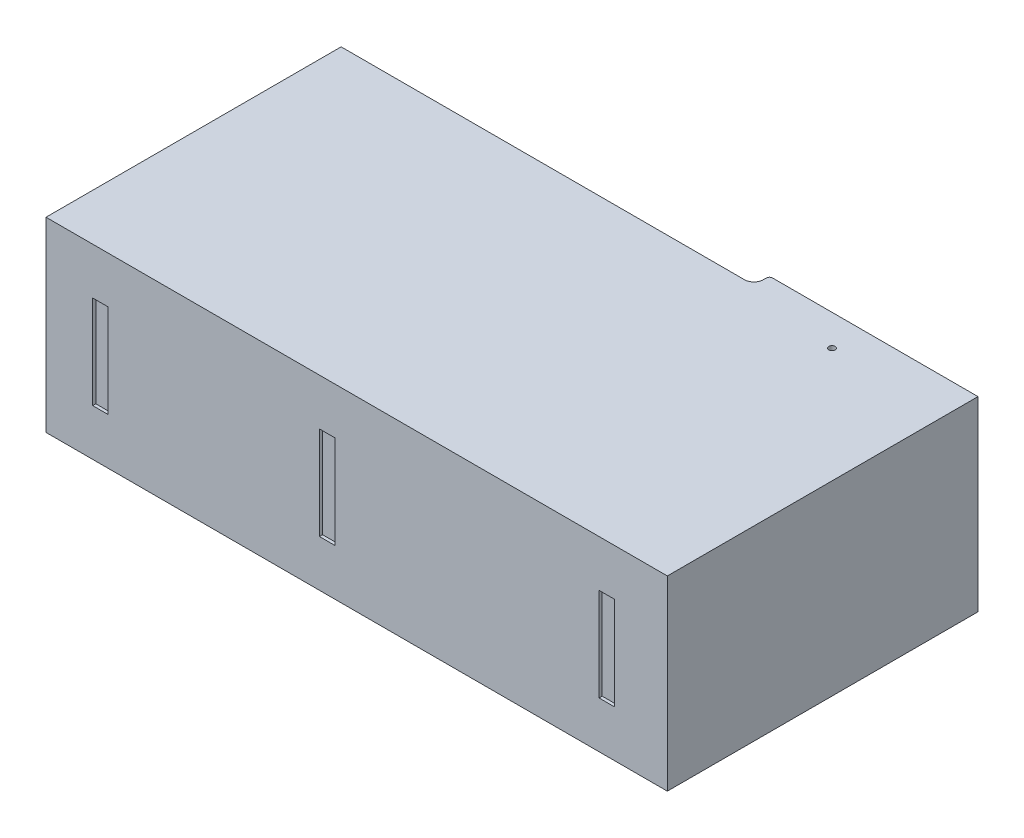
ISO-10303-21;
HEADER;
FILE_DESCRIPTION(('STEP AP214'),'2;1');
FILE_NAME('part.step','',(''),(''),'','','');
FILE_SCHEMA(('AUTOMOTIVE_DESIGN { 1 0 10303 214 1 1 1 1 }'));
ENDSEC;
DATA;
#1=APPLICATION_CONTEXT('core data for automotive mechanical design processes');
#2=APPLICATION_PROTOCOL_DEFINITION('international standard','automotive_design',2000,#1);
#3=PRODUCT_CONTEXT('',#1,'mechanical');
#4=PRODUCT('Part','Part','',(#3));
#5=PRODUCT_RELATED_PRODUCT_CATEGORY('part','',(#4));
#6=PRODUCT_DEFINITION_FORMATION('','',#4);
#7=PRODUCT_DEFINITION_CONTEXT('part definition',#1,'design');
#8=PRODUCT_DEFINITION('design','',#6,#7);
#9=PRODUCT_DEFINITION_SHAPE('','',#8);
#10=(LENGTH_UNIT() NAMED_UNIT(*) SI_UNIT(.MILLI.,.METRE.));
#11=(NAMED_UNIT(*) PLANE_ANGLE_UNIT() SI_UNIT($,.RADIAN.));
#12=(NAMED_UNIT(*) SI_UNIT($,.STERADIAN.) SOLID_ANGLE_UNIT());
#13=UNCERTAINTY_MEASURE_WITH_UNIT(LENGTH_MEASURE(1.E-05),#10,'distance_accuracy_value','');
#14=(GEOMETRIC_REPRESENTATION_CONTEXT(3) GLOBAL_UNCERTAINTY_ASSIGNED_CONTEXT((#13)) GLOBAL_UNIT_ASSIGNED_CONTEXT((#10,
#11,#12)) REPRESENTATION_CONTEXT('',''));
#15=CARTESIAN_POINT('',(0.,0.,0.));
#16=DIRECTION('',(0.,0.,1.));
#17=DIRECTION('',(1.,0.,0.));
#18=AXIS2_PLACEMENT_3D('',#15,#16,#17);
#19=CARTESIAN_POINT('',(3.28673392675044,6.,0.));
#20=DIRECTION('',(-1.,0.,0.));
#21=DIRECTION('',(0.,0.,1.));
#22=AXIS2_PLACEMENT_3D('',#19,#20,#21);
#23=PLANE('',#22);
#24=DIRECTION('',(0.,0.,-1.));
#25=VECTOR('',#24,1.);
#26=CARTESIAN_POINT('',(3.28673392675044,6.,0.));
#27=LINE('',#26,#25);
#28=CARTESIAN_POINT('',(3.28673392675044,6.,-4.8));
#29=VERTEX_POINT('',#28);
#30=CARTESIAN_POINT('',(3.28673392675044,6.,-4.9));
#31=VERTEX_POINT('',#30);
#32=EDGE_CURVE('E336',#29,#31,#27,.T.);
#33=ORIENTED_EDGE('',*,*,#32,.T.);
#34=DIRECTION('',(0.,-1.,0.));
#35=VECTOR('',#34,1.);
#36=CARTESIAN_POINT('',(3.28673392675044,0.,-4.9));
#37=LINE('',#36,#35);
#38=CARTESIAN_POINT('',(3.28673392675044,0.,-4.9));
#39=VERTEX_POINT('',#38);
#40=EDGE_CURVE('E387',#31,#39,#37,.T.);
#41=ORIENTED_EDGE('',*,*,#40,.T.);
#42=DIRECTION('',(0.,0.,-1.));
#43=VECTOR('',#42,1.);
#44=CARTESIAN_POINT('',(3.28673392675044,0.,0.));
#45=LINE('',#44,#43);
#46=CARTESIAN_POINT('',(3.28673392675044,0.,-4.8));
#47=VERTEX_POINT('',#46);
#48=EDGE_CURVE('E329',#47,#39,#45,.T.);
#49=ORIENTED_EDGE('',*,*,#48,.F.);
#50=DIRECTION('',(0.,-1.,0.));
#51=VECTOR('',#50,1.);
#52=CARTESIAN_POINT('',(3.28673392675044,6.,-4.8));
#53=LINE('',#52,#51);
#54=EDGE_CURVE('E385',#29,#47,#53,.T.);
#55=ORIENTED_EDGE('',*,*,#54,.F.);
#56=EDGE_LOOP('',(#33,#41,#49,#55));
#57=FACE_BOUND('',#56,.T.);
#58=ADVANCED_FACE('F37',(#57),#23,.T.);
#59=CARTESIAN_POINT('',(2.98673392675044,6.,-4.8));
#60=DIRECTION('',(0.,-1.,0.));
#61=DIRECTION('',(0.,0.,-1.));
#62=AXIS2_PLACEMENT_3D('',#59,#60,#61);
#63=CYLINDRICAL_SURFACE('',#62,0.3);
#64=CARTESIAN_POINT('',(2.98673392675044,0.,-4.8));
#65=DIRECTION('',(0.,1.,0.));
#66=DIRECTION('',(0.,0.,1.));
#67=AXIS2_PLACEMENT_3D('',#64,#65,#66);
#68=CIRCLE('',#67,0.3);
#69=CARTESIAN_POINT('',(2.98673392675043,0.,-4.5));
#70=VERTEX_POINT('',#69);
#71=EDGE_CURVE('E359',#47,#70,#68,.F.);
#72=ORIENTED_EDGE('',*,*,#71,.T.);
#73=DIRECTION('',(0.,-1.,0.));
#74=VECTOR('',#73,1.);
#75=CARTESIAN_POINT('',(2.98673392675043,6.,-4.5));
#76=LINE('',#75,#74);
#77=CARTESIAN_POINT('',(2.98673392675043,6.,-4.5));
#78=VERTEX_POINT('',#77);
#79=EDGE_CURVE('E383',#78,#70,#76,.T.);
#80=ORIENTED_EDGE('',*,*,#79,.F.);
#81=CARTESIAN_POINT('',(2.98673392675044,6.,-4.8));
#82=DIRECTION('',(0.,1.,0.));
#83=DIRECTION('',(0.,0.,1.));
#84=AXIS2_PLACEMENT_3D('',#81,#82,#83);
#85=CIRCLE('',#84,0.3);
#86=EDGE_CURVE('E339',#29,#78,#85,.F.);
#87=ORIENTED_EDGE('',*,*,#86,.F.);
#88=ORIENTED_EDGE('',*,*,#54,.T.);
#89=EDGE_LOOP('',(#72,#80,#87,#88));
#90=FACE_BOUND('',#89,.T.);
#91=ADVANCED_FACE('F413',(#90),#63,.F.);
#92=CARTESIAN_POINT('',(0.,6.,-4.5));
#93=DIRECTION('',(0.,0.,-1.));
#94=DIRECTION('',(-1.,0.,0.));
#95=AXIS2_PLACEMENT_3D('',#92,#93,#94);
#96=PLANE('',#95);
#97=DIRECTION('',(0.,-1.,0.));
#98=VECTOR('',#97,1.);
#99=CARTESIAN_POINT('',(1.38673392675044,1.35,-4.5));
#100=LINE('',#99,#98);
#101=CARTESIAN_POINT('',(1.38673392675044,4.65,-4.5));
#102=VERTEX_POINT('',#101);
#103=CARTESIAN_POINT('',(1.38673392675044,1.35,-4.5));
#104=VERTEX_POINT('',#103);
#105=EDGE_CURVE('E303',#102,#104,#100,.T.);
#106=ORIENTED_EDGE('',*,*,#105,.F.);
#107=DIRECTION('',(1.,0.,0.));
#108=VECTOR('',#107,1.);
#109=CARTESIAN_POINT('',(-0.613266073249563,4.65,-4.5));
#110=LINE('',#109,#108);
#111=CARTESIAN_POINT('',(-0.613266073249563,4.65,-4.5));
#112=VERTEX_POINT('',#111);
#113=EDGE_CURVE('E308',#112,#102,#110,.T.);
#114=ORIENTED_EDGE('',*,*,#113,.F.);
#115=DIRECTION('',(0.,1.,0.));
#116=VECTOR('',#115,1.);
#117=CARTESIAN_POINT('',(-0.613266073249563,1.35,-4.5));
#118=LINE('',#117,#116);
#119=CARTESIAN_POINT('',(-0.613266073249563,1.35,-4.5));
#120=VERTEX_POINT('',#119);
#121=EDGE_CURVE('E322',#120,#112,#118,.T.);
#122=ORIENTED_EDGE('',*,*,#121,.F.);
#123=DIRECTION('',(-1.,0.,0.));
#124=VECTOR('',#123,1.);
#125=CARTESIAN_POINT('',(-0.613266073249563,1.35,-4.5));
#126=LINE('',#125,#124);
#127=EDGE_CURVE('E319',#104,#120,#126,.T.);
#128=ORIENTED_EDGE('',*,*,#127,.F.);
#129=EDGE_LOOP('',(#106,#114,#122,#128));
#130=FACE_BOUND('',#129,.T.);
#131=DIRECTION('',(1.,0.,0.));
#132=VECTOR('',#131,1.);
#133=CARTESIAN_POINT('',(0.,0.,-4.5));
#134=LINE('',#133,#132);
#135=CARTESIAN_POINT('',(-10.,0.,-4.5));
#136=VERTEX_POINT('',#135);
#137=EDGE_CURVE('E362',#136,#70,#134,.T.);
#138=ORIENTED_EDGE('',*,*,#137,.F.);
#139=DIRECTION('',(0.,-1.,0.));
#140=VECTOR('',#139,1.);
#141=CARTESIAN_POINT('',(-10.,6.,-4.5));
#142=LINE('',#141,#140);
#143=CARTESIAN_POINT('',(-10.,6.,-4.5));
#144=VERTEX_POINT('',#143);
#145=EDGE_CURVE('E381',#144,#136,#142,.T.);
#146=ORIENTED_EDGE('',*,*,#145,.F.);
#147=DIRECTION('',(1.,0.,0.));
#148=VECTOR('',#147,1.);
#149=CARTESIAN_POINT('',(0.,6.,-4.5));
#150=LINE('',#149,#148);
#151=EDGE_CURVE('E342',#144,#78,#150,.T.);
#152=ORIENTED_EDGE('',*,*,#151,.T.);
#153=ORIENTED_EDGE('',*,*,#79,.T.);
#154=EDGE_LOOP('',(#138,#146,#152,#153));
#155=FACE_BOUND('',#154,.T.);
#156=ADVANCED_FACE('F440',(#130,#155),#96,.T.);
#157=CARTESIAN_POINT('',(-10.,6.,0.));
#158=DIRECTION('',(-1.,0.,0.));
#159=DIRECTION('',(0.,0.,1.));
#160=AXIS2_PLACEMENT_3D('',#157,#158,#159);
#161=PLANE('',#160);
#162=DIRECTION('',(0.,0.,-1.));
#163=VECTOR('',#162,1.);
#164=CARTESIAN_POINT('',(-10.,0.,0.));
#165=LINE('',#164,#163);
#166=CARTESIAN_POINT('',(-10.,0.,5.));
#167=VERTEX_POINT('',#166);
#168=EDGE_CURVE('E365',#167,#136,#165,.T.);
#169=ORIENTED_EDGE('',*,*,#168,.F.);
#170=DIRECTION('',(0.,-1.,0.));
#171=VECTOR('',#170,1.);
#172=CARTESIAN_POINT('',(-10.,6.,5.));
#173=LINE('',#172,#171);
#174=CARTESIAN_POINT('',(-10.,6.,5.));
#175=VERTEX_POINT('',#174);
#176=EDGE_CURVE('E379',#175,#167,#173,.T.);
#177=ORIENTED_EDGE('',*,*,#176,.F.);
#178=DIRECTION('',(0.,0.,-1.));
#179=VECTOR('',#178,1.);
#180=CARTESIAN_POINT('',(-10.,6.,0.));
#181=LINE('',#180,#179);
#182=EDGE_CURVE('E345',#175,#144,#181,.T.);
#183=ORIENTED_EDGE('',*,*,#182,.T.);
#184=ORIENTED_EDGE('',*,*,#145,.T.);
#185=EDGE_LOOP('',(#169,#177,#183,#184));
#186=FACE_BOUND('',#185,.T.);
#187=ADVANCED_FACE('F420',(#186),#161,.T.);
#188=CARTESIAN_POINT('',(0.,6.,5.));
#189=DIRECTION('',(0.,0.,1.));
#190=DIRECTION('',(1.,0.,0.));
#191=AXIS2_PLACEMENT_3D('',#188,#189,#190);
#192=PLANE('',#191);
#193=DIRECTION('',(0.,-1.,0.));
#194=VECTOR('',#193,1.);
#195=CARTESIAN_POINT('',(-8.49720041105568,1.5,5.));
#196=LINE('',#195,#194);
#197=CARTESIAN_POINT('',(-8.49720041105568,4.5,5.));
#198=VERTEX_POINT('',#197);
#199=CARTESIAN_POINT('',(-8.49720041105568,1.5,5.));
#200=VERTEX_POINT('',#199);
#201=EDGE_CURVE('E52',#198,#200,#196,.T.);
#202=ORIENTED_EDGE('',*,*,#201,.F.);
#203=DIRECTION('',(-1.,0.,0.));
#204=VECTOR('',#203,1.);
#205=CARTESIAN_POINT('',(-7.99720041105568,4.5,5.));
#206=LINE('',#205,#204);
#207=CARTESIAN_POINT('',(-7.99720041105568,4.5,5.));
#208=VERTEX_POINT('',#207);
#209=EDGE_CURVE('E217',#208,#198,#206,.T.);
#210=ORIENTED_EDGE('',*,*,#209,.F.);
#211=DIRECTION('',(0.,1.,0.));
#212=VECTOR('',#211,1.);
#213=CARTESIAN_POINT('',(-7.99720041105568,1.5,5.));
#214=LINE('',#213,#212);
#215=CARTESIAN_POINT('',(-7.99720041105568,1.5,5.));
#216=VERTEX_POINT('',#215);
#217=EDGE_CURVE('E220',#216,#208,#214,.T.);
#218=ORIENTED_EDGE('',*,*,#217,.F.);
#219=DIRECTION('',(1.,0.,0.));
#220=VECTOR('',#219,1.);
#221=CARTESIAN_POINT('',(-7.99720041105568,1.5,5.));
#222=LINE('',#221,#220);
#223=EDGE_CURVE('E226',#200,#216,#222,.T.);
#224=ORIENTED_EDGE('',*,*,#223,.F.);
#225=EDGE_LOOP('',(#202,#210,#218,#224));
#226=FACE_BOUND('',#225,.T.);
#227=DIRECTION('',(0.,-1.,0.));
#228=VECTOR('',#227,1.);
#229=CARTESIAN_POINT('',(-1.19720041105568,1.5,5.));
#230=LINE('',#229,#228);
#231=CARTESIAN_POINT('',(-1.19720041105568,4.5,5.));
#232=VERTEX_POINT('',#231);
#233=CARTESIAN_POINT('',(-1.19720041105568,1.5,5.));
#234=VERTEX_POINT('',#233);
#235=EDGE_CURVE('E60',#232,#234,#230,.T.);
#236=ORIENTED_EDGE('',*,*,#235,.F.);
#237=DIRECTION('',(-1.,0.,0.));
#238=VECTOR('',#237,1.);
#239=CARTESIAN_POINT('',(-0.69720041105568,4.5,5.));
#240=LINE('',#239,#238);
#241=CARTESIAN_POINT('',(-0.69720041105568,4.5,5.));
#242=VERTEX_POINT('',#241);
#243=EDGE_CURVE('E241',#242,#232,#240,.T.);
#244=ORIENTED_EDGE('',*,*,#243,.F.);
#245=DIRECTION('',(0.,1.,0.));
#246=VECTOR('',#245,1.);
#247=CARTESIAN_POINT('',(-0.69720041105568,1.5,5.));
#248=LINE('',#247,#246);
#249=CARTESIAN_POINT('',(-0.69720041105568,1.5,5.));
#250=VERTEX_POINT('',#249);
#251=EDGE_CURVE('E256',#250,#242,#248,.T.);
#252=ORIENTED_EDGE('',*,*,#251,.F.);
#253=DIRECTION('',(1.,0.,0.));
#254=VECTOR('',#253,1.);
#255=CARTESIAN_POINT('',(-0.69720041105568,1.5,5.));
#256=LINE('',#255,#254);
#257=EDGE_CURVE('E252',#234,#250,#256,.T.);
#258=ORIENTED_EDGE('',*,*,#257,.F.);
#259=EDGE_LOOP('',(#236,#244,#252,#258));
#260=FACE_BOUND('',#259,.T.);
#261=DIRECTION('',(0.,-1.,0.));
#262=VECTOR('',#261,1.);
#263=CARTESIAN_POINT('',(7.80279958894432,1.5,5.));
#264=LINE('',#263,#262);
#265=CARTESIAN_POINT('',(7.80279958894432,4.5,5.));
#266=VERTEX_POINT('',#265);
#267=CARTESIAN_POINT('',(7.80279958894432,1.5,5.));
#268=VERTEX_POINT('',#267);
#269=EDGE_CURVE('E281',#266,#268,#264,.T.);
#270=ORIENTED_EDGE('',*,*,#269,.F.);
#271=DIRECTION('',(-1.,0.,0.));
#272=VECTOR('',#271,1.);
#273=CARTESIAN_POINT('',(8.30279958894432,4.5,5.));
#274=LINE('',#273,#272);
#275=CARTESIAN_POINT('',(8.30279958894432,4.5,5.));
#276=VERTEX_POINT('',#275);
#277=EDGE_CURVE('E271',#276,#266,#274,.T.);
#278=ORIENTED_EDGE('',*,*,#277,.F.);
#279=DIRECTION('',(0.,1.,0.));
#280=VECTOR('',#279,1.);
#281=CARTESIAN_POINT('',(8.30279958894432,1.5,5.));
#282=LINE('',#281,#280);
#283=CARTESIAN_POINT('',(8.30279958894432,1.5,5.));
#284=VERTEX_POINT('',#283);
#285=EDGE_CURVE('E286',#284,#276,#282,.T.);
#286=ORIENTED_EDGE('',*,*,#285,.F.);
#287=DIRECTION('',(1.,0.,0.));
#288=VECTOR('',#287,1.);
#289=CARTESIAN_POINT('',(8.30279958894432,1.5,5.));
#290=LINE('',#289,#288);
#291=EDGE_CURVE('E283',#268,#284,#290,.T.);
#292=ORIENTED_EDGE('',*,*,#291,.F.);
#293=EDGE_LOOP('',(#270,#278,#286,#292));
#294=FACE_BOUND('',#293,.T.);
#295=DIRECTION('',(-1.,0.,0.));
#296=VECTOR('',#295,1.);
#297=CARTESIAN_POINT('',(0.,0.,5.));
#298=LINE('',#297,#296);
#299=CARTESIAN_POINT('',(10.,0.,5.));
#300=VERTEX_POINT('',#299);
#301=EDGE_CURVE('E368',#300,#167,#298,.T.);
#302=ORIENTED_EDGE('',*,*,#301,.F.);
#303=DIRECTION('',(0.,-1.,0.));
#304=VECTOR('',#303,1.);
#305=CARTESIAN_POINT('',(10.,6.,5.));
#306=LINE('',#305,#304);
#307=CARTESIAN_POINT('',(10.,6.,5.));
#308=VERTEX_POINT('',#307);
#309=EDGE_CURVE('E377',#308,#300,#306,.T.);
#310=ORIENTED_EDGE('',*,*,#309,.F.);
#311=DIRECTION('',(-1.,0.,0.));
#312=VECTOR('',#311,1.);
#313=CARTESIAN_POINT('',(0.,6.,5.));
#314=LINE('',#313,#312);
#315=EDGE_CURVE('E348',#308,#175,#314,.T.);
#316=ORIENTED_EDGE('',*,*,#315,.T.);
#317=ORIENTED_EDGE('',*,*,#176,.T.);
#318=EDGE_LOOP('',(#302,#310,#316,#317));
#319=FACE_BOUND('',#318,.T.);
#320=ADVANCED_FACE('F423',(#226,#260,#294,#319),#192,.T.);
#321=CARTESIAN_POINT('',(10.,6.,0.));
#322=DIRECTION('',(-1.,0.,0.));
#323=DIRECTION('',(0.,0.,1.));
#324=AXIS2_PLACEMENT_3D('',#321,#322,#323);
#325=PLANE('',#324);
#326=DIRECTION('',(0.,0.,-1.));
#327=VECTOR('',#326,1.);
#328=CARTESIAN_POINT('',(10.,0.,0.));
#329=LINE('',#328,#327);
#330=CARTESIAN_POINT('',(10.,0.,-5.));
#331=VERTEX_POINT('',#330);
#332=EDGE_CURVE('E371',#300,#331,#329,.T.);
#333=ORIENTED_EDGE('',*,*,#332,.T.);
#334=DIRECTION('',(0.,-1.,0.));
#335=VECTOR('',#334,1.);
#336=CARTESIAN_POINT('',(10.,6.,-5.));
#337=LINE('',#336,#335);
#338=CARTESIAN_POINT('',(10.,6.,-5.));
#339=VERTEX_POINT('',#338);
#340=EDGE_CURVE('E356',#339,#331,#337,.T.);
#341=ORIENTED_EDGE('',*,*,#340,.F.);
#342=DIRECTION('',(0.,0.,-1.));
#343=VECTOR('',#342,1.);
#344=CARTESIAN_POINT('',(10.,6.,0.));
#345=LINE('',#344,#343);
#346=EDGE_CURVE('E351',#308,#339,#345,.T.);
#347=ORIENTED_EDGE('',*,*,#346,.F.);
#348=ORIENTED_EDGE('',*,*,#309,.T.);
#349=EDGE_LOOP('',(#333,#341,#347,#348));
#350=FACE_BOUND('',#349,.T.);
#351=ADVANCED_FACE('F426',(#350),#325,.F.);
#352=CARTESIAN_POINT('',(0.,6.,-5.));
#353=DIRECTION('',(0.,0.,1.));
#354=DIRECTION('',(1.,0.,0.));
#355=AXIS2_PLACEMENT_3D('',#352,#353,#354);
#356=PLANE('',#355);
#357=DIRECTION('',(-1.,0.,0.));
#358=VECTOR('',#357,1.);
#359=CARTESIAN_POINT('',(0.,0.,-5.));
#360=LINE('',#359,#358);
#361=CARTESIAN_POINT('',(3.38673392675044,0.,-5.));
#362=VERTEX_POINT('',#361);
#363=EDGE_CURVE('E340',#331,#362,#360,.T.);
#364=ORIENTED_EDGE('',*,*,#363,.T.);
#365=DIRECTION('',(0.,-1.,0.));
#366=VECTOR('',#365,1.);
#367=CARTESIAN_POINT('',(3.38673392675044,6.,-5.));
#368=LINE('',#367,#366);
#369=CARTESIAN_POINT('',(3.38673392675044,6.,-5.));
#370=VERTEX_POINT('',#369);
#371=EDGE_CURVE('E45',#362,#370,#368,.F.);
#372=ORIENTED_EDGE('',*,*,#371,.T.);
#373=DIRECTION('',(-1.,0.,0.));
#374=VECTOR('',#373,1.);
#375=CARTESIAN_POINT('',(0.,6.,-5.));
#376=LINE('',#375,#374);
#377=EDGE_CURVE('E353',#339,#370,#376,.T.);
#378=ORIENTED_EDGE('',*,*,#377,.F.);
#379=ORIENTED_EDGE('',*,*,#340,.T.);
#380=EDGE_LOOP('',(#364,#372,#378,#379));
#381=FACE_BOUND('',#380,.T.);
#382=ADVANCED_FACE('F394',(#381),#356,.F.);
#383=CARTESIAN_POINT('',(0.,6.,0.));
#384=DIRECTION('',(0.,1.,0.));
#385=DIRECTION('',(0.,0.,1.));
#386=AXIS2_PLACEMENT_3D('',#383,#384,#385);
#387=PLANE('',#386);
#388=CARTESIAN_POINT('',(6.3,6.,-4.));
#389=DIRECTION('',(0.,1.,0.));
#390=DIRECTION('',(0.,0.,1.));
#391=AXIS2_PLACEMENT_3D('',#388,#389,#390);
#392=CIRCLE('',#391,0.1);
#393=CARTESIAN_POINT('',(6.3,6.,-3.9));
#394=VERTEX_POINT('',#393);
#395=EDGE_CURVE('E233',#394,#394,#392,.T.);
#396=ORIENTED_EDGE('',*,*,#395,.F.);
#397=EDGE_LOOP('',(#396));
#398=FACE_BOUND('',#397,.T.);
#399=ORIENTED_EDGE('',*,*,#377,.T.);
#400=CARTESIAN_POINT('',(3.38673392675044,6.,-4.9));
#401=DIRECTION('',(0.,1.,0.));
#402=DIRECTION('',(0.,0.,1.));
#403=AXIS2_PLACEMENT_3D('',#400,#401,#402);
#404=CIRCLE('',#403,0.1);
#405=EDGE_CURVE('E11',#370,#31,#404,.T.);
#406=ORIENTED_EDGE('',*,*,#405,.T.);
#407=ORIENTED_EDGE('',*,*,#32,.F.);
#408=ORIENTED_EDGE('',*,*,#86,.T.);
#409=ORIENTED_EDGE('',*,*,#151,.F.);
#410=ORIENTED_EDGE('',*,*,#182,.F.);
#411=ORIENTED_EDGE('',*,*,#315,.F.);
#412=ORIENTED_EDGE('',*,*,#346,.T.);
#413=EDGE_LOOP('',(#399,#406,#407,#408,#409,#410,#411,#412));
#414=FACE_BOUND('',#413,.T.);
#415=ADVANCED_FACE('F399',(#398,#414),#387,.T.);
#416=CARTESIAN_POINT('',(0.,0.,0.));
#417=DIRECTION('',(0.,1.,0.));
#418=DIRECTION('',(0.,0.,1.));
#419=AXIS2_PLACEMENT_3D('',#416,#417,#418);
#420=PLANE('',#419);
#421=CARTESIAN_POINT('',(6.3,0.,-4.));
#422=DIRECTION('',(0.,1.,0.));
#423=DIRECTION('',(0.,0.,1.));
#424=AXIS2_PLACEMENT_3D('',#421,#422,#423);
#425=CIRCLE('',#424,0.1);
#426=CARTESIAN_POINT('',(6.3,0.,-3.9));
#427=VERTEX_POINT('',#426);
#428=EDGE_CURVE('E300',#427,#427,#425,.F.);
#429=ORIENTED_EDGE('',*,*,#428,.F.);
#430=EDGE_LOOP('',(#429));
#431=FACE_BOUND('',#430,.T.);
#432=ORIENTED_EDGE('',*,*,#48,.T.);
#433=CARTESIAN_POINT('',(3.38673392675044,0.,-4.9));
#434=DIRECTION('',(0.,1.,0.));
#435=DIRECTION('',(0.,0.,1.));
#436=AXIS2_PLACEMENT_3D('',#433,#434,#435);
#437=CIRCLE('',#436,0.1);
#438=EDGE_CURVE('E390',#39,#362,#437,.F.);
#439=ORIENTED_EDGE('',*,*,#438,.T.);
#440=ORIENTED_EDGE('',*,*,#363,.F.);
#441=ORIENTED_EDGE('',*,*,#332,.F.);
#442=ORIENTED_EDGE('',*,*,#301,.T.);
#443=ORIENTED_EDGE('',*,*,#168,.T.);
#444=ORIENTED_EDGE('',*,*,#137,.T.);
#445=ORIENTED_EDGE('',*,*,#71,.F.);
#446=EDGE_LOOP('',(#432,#439,#440,#441,#442,#443,#444,#445));
#447=FACE_BOUND('',#446,.T.);
#448=ADVANCED_FACE('F409',(#431,#447),#420,.F.);
#449=CARTESIAN_POINT('',(3.38673392675044,6.,-4.9));
#450=DIRECTION('',(0.,1.,0.));
#451=DIRECTION('',(0.,0.,1.));
#452=AXIS2_PLACEMENT_3D('',#449,#450,#451);
#453=CYLINDRICAL_SURFACE('',#452,0.1);
#454=ORIENTED_EDGE('',*,*,#405,.F.);
#455=ORIENTED_EDGE('',*,*,#371,.F.);
#456=ORIENTED_EDGE('',*,*,#438,.F.);
#457=ORIENTED_EDGE('',*,*,#40,.F.);
#458=EDGE_LOOP('',(#454,#455,#456,#457));
#459=FACE_BOUND('',#458,.T.);
#460=ADVANCED_FACE('F39',(#459),#453,.T.);
#461=CARTESIAN_POINT('',(1.38673392675044,1.35,0.5));
#462=DIRECTION('',(1.,0.,0.));
#463=DIRECTION('',(0.,0.,-1.));
#464=AXIS2_PLACEMENT_3D('',#461,#462,#463);
#465=PLANE('',#464);
#466=ORIENTED_EDGE('',*,*,#105,.T.);
#467=DIRECTION('',(0.,0.,-1.));
#468=VECTOR('',#467,1.);
#469=CARTESIAN_POINT('',(1.38673392675044,1.35,0.5));
#470=LINE('',#469,#468);
#471=CARTESIAN_POINT('',(1.38673392675044,1.35,0.5));
#472=VERTEX_POINT('',#471);
#473=EDGE_CURVE('E317',#472,#104,#470,.T.);
#474=ORIENTED_EDGE('',*,*,#473,.F.);
#475=DIRECTION('',(0.,-1.,0.));
#476=VECTOR('',#475,1.);
#477=CARTESIAN_POINT('',(1.38673392675044,1.35,0.5));
#478=LINE('',#477,#476);
#479=CARTESIAN_POINT('',(1.38673392675044,4.65,0.5));
#480=VERTEX_POINT('',#479);
#481=EDGE_CURVE('E304',#480,#472,#478,.T.);
#482=ORIENTED_EDGE('',*,*,#481,.F.);
#483=DIRECTION('',(0.,0.,-1.));
#484=VECTOR('',#483,1.);
#485=CARTESIAN_POINT('',(1.38673392675044,4.65,0.5));
#486=LINE('',#485,#484);
#487=EDGE_CURVE('E327',#480,#102,#486,.T.);
#488=ORIENTED_EDGE('',*,*,#487,.T.);
#489=EDGE_LOOP('',(#466,#474,#482,#488));
#490=FACE_BOUND('',#489,.T.);
#491=ADVANCED_FACE('F622',(#490),#465,.F.);
#492=CARTESIAN_POINT('',(-0.613266073249563,4.65,0.5));
#493=DIRECTION('',(0.,1.,0.));
#494=DIRECTION('',(0.,0.,1.));
#495=AXIS2_PLACEMENT_3D('',#492,#493,#494);
#496=PLANE('',#495);
#497=ORIENTED_EDGE('',*,*,#113,.T.);
#498=ORIENTED_EDGE('',*,*,#487,.F.);
#499=DIRECTION('',(1.,0.,0.));
#500=VECTOR('',#499,1.);
#501=CARTESIAN_POINT('',(-0.613266073249563,4.65,0.5));
#502=LINE('',#501,#500);
#503=CARTESIAN_POINT('',(-0.613266073249563,4.65,0.5));
#504=VERTEX_POINT('',#503);
#505=EDGE_CURVE('E314',#504,#480,#502,.T.);
#506=ORIENTED_EDGE('',*,*,#505,.F.);
#507=DIRECTION('',(0.,0.,-1.));
#508=VECTOR('',#507,1.);
#509=CARTESIAN_POINT('',(-0.613266073249563,4.65,0.5));
#510=LINE('',#509,#508);
#511=EDGE_CURVE('E330',#504,#112,#510,.T.);
#512=ORIENTED_EDGE('',*,*,#511,.T.);
#513=EDGE_LOOP('',(#497,#498,#506,#512));
#514=FACE_BOUND('',#513,.T.);
#515=ADVANCED_FACE('F618',(#514),#496,.F.);
#516=CARTESIAN_POINT('',(-0.613266073249563,1.35,0.5));
#517=DIRECTION('',(-1.,0.,0.));
#518=DIRECTION('',(0.,0.,1.));
#519=AXIS2_PLACEMENT_3D('',#516,#517,#518);
#520=PLANE('',#519);
#521=ORIENTED_EDGE('',*,*,#121,.T.);
#522=ORIENTED_EDGE('',*,*,#511,.F.);
#523=DIRECTION('',(0.,1.,0.));
#524=VECTOR('',#523,1.);
#525=CARTESIAN_POINT('',(-0.613266073249563,1.35,0.5));
#526=LINE('',#525,#524);
#527=CARTESIAN_POINT('',(-0.613266073249563,1.35,0.5));
#528=VERTEX_POINT('',#527);
#529=EDGE_CURVE('E311',#528,#504,#526,.T.);
#530=ORIENTED_EDGE('',*,*,#529,.F.);
#531=DIRECTION('',(0.,0.,-1.));
#532=VECTOR('',#531,1.);
#533=CARTESIAN_POINT('',(-0.613266073249563,1.35,0.5));
#534=LINE('',#533,#532);
#535=EDGE_CURVE('E332',#528,#120,#534,.T.);
#536=ORIENTED_EDGE('',*,*,#535,.T.);
#537=EDGE_LOOP('',(#521,#522,#530,#536));
#538=FACE_BOUND('',#537,.T.);
#539=ADVANCED_FACE('F621',(#538),#520,.F.);
#540=CARTESIAN_POINT('',(-0.613266073249563,1.35,0.5));
#541=DIRECTION('',(0.,-1.,0.));
#542=DIRECTION('',(1.,0.,0.));
#543=AXIS2_PLACEMENT_3D('',#540,#541,#542);
#544=PLANE('',#543);
#545=ORIENTED_EDGE('',*,*,#127,.T.);
#546=ORIENTED_EDGE('',*,*,#535,.F.);
#547=DIRECTION('',(-1.,0.,0.));
#548=VECTOR('',#547,1.);
#549=CARTESIAN_POINT('',(-0.613266073249563,1.35,0.5));
#550=LINE('',#549,#548);
#551=EDGE_CURVE('E307',#472,#528,#550,.T.);
#552=ORIENTED_EDGE('',*,*,#551,.F.);
#553=ORIENTED_EDGE('',*,*,#473,.T.);
#554=EDGE_LOOP('',(#545,#546,#552,#553));
#555=FACE_BOUND('',#554,.T.);
#556=ADVANCED_FACE('F616',(#555),#544,.F.);
#557=CARTESIAN_POINT('',(0.,0.,0.5));
#558=DIRECTION('',(0.,0.,-1.));
#559=DIRECTION('',(-1.,0.,0.));
#560=AXIS2_PLACEMENT_3D('',#557,#558,#559);
#561=PLANE('',#560);
#562=ORIENTED_EDGE('',*,*,#481,.T.);
#563=ORIENTED_EDGE('',*,*,#551,.T.);
#564=ORIENTED_EDGE('',*,*,#529,.T.);
#565=ORIENTED_EDGE('',*,*,#505,.T.);
#566=EDGE_LOOP('',(#562,#563,#564,#565));
#567=FACE_BOUND('',#566,.T.);
#568=ADVANCED_FACE('F612',(#567),#561,.T.);
#569=CARTESIAN_POINT('',(6.3,-0.282842712474619,-4.));
#570=DIRECTION('',(0.,1.,0.));
#571=DIRECTION('',(0.,0.,1.));
#572=AXIS2_PLACEMENT_3D('',#569,#570,#571);
#573=CYLINDRICAL_SURFACE('',#572,0.1);
#574=ORIENTED_EDGE('',*,*,#428,.T.);
#575=EDGE_LOOP('',(#574));
#576=FACE_BOUND('',#575,.T.);
#577=ORIENTED_EDGE('',*,*,#395,.T.);
#578=EDGE_LOOP('',(#577));
#579=FACE_BOUND('',#578,.T.);
#580=ADVANCED_FACE('F463',(#576,#579),#573,.F.);
#581=CARTESIAN_POINT('',(7.80279958894432,1.5,4.9));
#582=DIRECTION('',(-1.,0.,0.));
#583=DIRECTION('',(0.,-1.,0.));
#584=AXIS2_PLACEMENT_3D('',#581,#582,#583);
#585=PLANE('',#584);
#586=ORIENTED_EDGE('',*,*,#269,.T.);
#587=DIRECTION('',(0.,0.,1.));
#588=VECTOR('',#587,1.);
#589=CARTESIAN_POINT('',(7.80279958894432,1.5,4.9));
#590=LINE('',#589,#588);
#591=CARTESIAN_POINT('',(7.80279958894432,1.5,4.9));
#592=VERTEX_POINT('',#591);
#593=EDGE_CURVE('E280',#592,#268,#590,.T.);
#594=ORIENTED_EDGE('',*,*,#593,.F.);
#595=DIRECTION('',(0.,-1.,0.));
#596=VECTOR('',#595,1.);
#597=CARTESIAN_POINT('',(7.80279958894432,1.5,4.9));
#598=LINE('',#597,#596);
#599=CARTESIAN_POINT('',(7.80279958894432,4.5,4.9));
#600=VERTEX_POINT('',#599);
#601=EDGE_CURVE('E267',#600,#592,#598,.T.);
#602=ORIENTED_EDGE('',*,*,#601,.F.);
#603=DIRECTION('',(0.,0.,1.));
#604=VECTOR('',#603,1.);
#605=CARTESIAN_POINT('',(7.80279958894432,4.5,4.9));
#606=LINE('',#605,#604);
#607=EDGE_CURVE('E253',#600,#266,#606,.T.);
#608=ORIENTED_EDGE('',*,*,#607,.T.);
#609=EDGE_LOOP('',(#586,#594,#602,#608));
#610=FACE_BOUND('',#609,.T.);
#611=ADVANCED_FACE('F468',(#610),#585,.F.);
#612=CARTESIAN_POINT('',(8.30279958894432,4.5,4.9));
#613=DIRECTION('',(0.,1.,0.));
#614=DIRECTION('',(0.,0.,1.));
#615=AXIS2_PLACEMENT_3D('',#612,#613,#614);
#616=PLANE('',#615);
#617=ORIENTED_EDGE('',*,*,#277,.T.);
#618=ORIENTED_EDGE('',*,*,#607,.F.);
#619=DIRECTION('',(-1.,0.,0.));
#620=VECTOR('',#619,1.);
#621=CARTESIAN_POINT('',(8.30279958894432,4.5,4.9));
#622=LINE('',#621,#620);
#623=CARTESIAN_POINT('',(8.30279958894432,4.5,4.9));
#624=VERTEX_POINT('',#623);
#625=EDGE_CURVE('E277',#624,#600,#622,.T.);
#626=ORIENTED_EDGE('',*,*,#625,.F.);
#627=DIRECTION('',(0.,0.,1.));
#628=VECTOR('',#627,1.);
#629=CARTESIAN_POINT('',(8.30279958894432,4.5,4.9));
#630=LINE('',#629,#628);
#631=EDGE_CURVE('E292',#624,#276,#630,.T.);
#632=ORIENTED_EDGE('',*,*,#631,.T.);
#633=EDGE_LOOP('',(#617,#618,#626,#632));
#634=FACE_BOUND('',#633,.T.);
#635=ADVANCED_FACE('F473',(#634),#616,.F.);
#636=CARTESIAN_POINT('',(8.30279958894432,1.5,4.9));
#637=DIRECTION('',(1.,0.,0.));
#638=DIRECTION('',(0.,1.,0.));
#639=AXIS2_PLACEMENT_3D('',#636,#637,#638);
#640=PLANE('',#639);
#641=ORIENTED_EDGE('',*,*,#285,.T.);
#642=ORIENTED_EDGE('',*,*,#631,.F.);
#643=DIRECTION('',(0.,1.,0.));
#644=VECTOR('',#643,1.);
#645=CARTESIAN_POINT('',(8.30279958894432,1.5,4.9));
#646=LINE('',#645,#644);
#647=CARTESIAN_POINT('',(8.30279958894432,1.5,4.9));
#648=VERTEX_POINT('',#647);
#649=EDGE_CURVE('E274',#648,#624,#646,.T.);
#650=ORIENTED_EDGE('',*,*,#649,.F.);
#651=DIRECTION('',(0.,0.,1.));
#652=VECTOR('',#651,1.);
#653=CARTESIAN_POINT('',(8.30279958894432,1.5,4.9));
#654=LINE('',#653,#652);
#655=EDGE_CURVE('E294',#648,#284,#654,.T.);
#656=ORIENTED_EDGE('',*,*,#655,.T.);
#657=EDGE_LOOP('',(#641,#642,#650,#656));
#658=FACE_BOUND('',#657,.T.);
#659=ADVANCED_FACE('F483',(#658),#640,.F.);
#660=CARTESIAN_POINT('',(8.30279958894432,1.5,4.9));
#661=DIRECTION('',(0.,-1.,0.));
#662=DIRECTION('',(0.,0.,-1.));
#663=AXIS2_PLACEMENT_3D('',#660,#661,#662);
#664=PLANE('',#663);
#665=ORIENTED_EDGE('',*,*,#291,.T.);
#666=ORIENTED_EDGE('',*,*,#655,.F.);
#667=DIRECTION('',(1.,0.,0.));
#668=VECTOR('',#667,1.);
#669=CARTESIAN_POINT('',(8.30279958894432,1.5,4.9));
#670=LINE('',#669,#668);
#671=EDGE_CURVE('E270',#592,#648,#670,.T.);
#672=ORIENTED_EDGE('',*,*,#671,.F.);
#673=ORIENTED_EDGE('',*,*,#593,.T.);
#674=EDGE_LOOP('',(#665,#666,#672,#673));
#675=FACE_BOUND('',#674,.T.);
#676=ADVANCED_FACE('F493',(#675),#664,.F.);
#677=CARTESIAN_POINT('',(0.,0.,4.9));
#678=DIRECTION('',(0.,0.,1.));
#679=DIRECTION('',(1.,0.,0.));
#680=AXIS2_PLACEMENT_3D('',#677,#678,#679);
#681=PLANE('',#680);
#682=ORIENTED_EDGE('',*,*,#601,.T.);
#683=ORIENTED_EDGE('',*,*,#671,.T.);
#684=ORIENTED_EDGE('',*,*,#649,.T.);
#685=ORIENTED_EDGE('',*,*,#625,.T.);
#686=EDGE_LOOP('',(#682,#683,#684,#685));
#687=FACE_BOUND('',#686,.T.);
#688=ADVANCED_FACE('F503',(#687),#681,.T.);
#689=CARTESIAN_POINT('',(-1.19720041105568,1.5,4.9));
#690=DIRECTION('',(-1.,0.,0.));
#691=DIRECTION('',(0.,-1.,0.));
#692=AXIS2_PLACEMENT_3D('',#689,#690,#691);
#693=PLANE('',#692);
#694=ORIENTED_EDGE('',*,*,#235,.T.);
#695=DIRECTION('',(0.,0.,1.));
#696=VECTOR('',#695,1.);
#697=CARTESIAN_POINT('',(-1.19720041105568,1.5,4.9));
#698=LINE('',#697,#696);
#699=CARTESIAN_POINT('',(-1.19720041105568,1.5,4.9));
#700=VERTEX_POINT('',#699);
#701=EDGE_CURVE('E250',#700,#234,#698,.T.);
#702=ORIENTED_EDGE('',*,*,#701,.F.);
#703=DIRECTION('',(0.,-1.,0.));
#704=VECTOR('',#703,1.);
#705=CARTESIAN_POINT('',(-1.19720041105568,1.5,4.9));
#706=LINE('',#705,#704);
#707=CARTESIAN_POINT('',(-1.19720041105568,4.5,4.9));
#708=VERTEX_POINT('',#707);
#709=EDGE_CURVE('E237',#708,#700,#706,.T.);
#710=ORIENTED_EDGE('',*,*,#709,.F.);
#711=DIRECTION('',(0.,0.,1.));
#712=VECTOR('',#711,1.);
#713=CARTESIAN_POINT('',(-1.19720041105568,4.5,4.9));
#714=LINE('',#713,#712);
#715=EDGE_CURVE('E227',#708,#232,#714,.T.);
#716=ORIENTED_EDGE('',*,*,#715,.T.);
#717=EDGE_LOOP('',(#694,#702,#710,#716));
#718=FACE_BOUND('',#717,.T.);
#719=ADVANCED_FACE('F513',(#718),#693,.F.);
#720=CARTESIAN_POINT('',(-0.69720041105568,4.5,4.9));
#721=DIRECTION('',(0.,1.,0.));
#722=DIRECTION('',(0.,0.,1.));
#723=AXIS2_PLACEMENT_3D('',#720,#721,#722);
#724=PLANE('',#723);
#725=ORIENTED_EDGE('',*,*,#243,.T.);
#726=ORIENTED_EDGE('',*,*,#715,.F.);
#727=DIRECTION('',(-1.,0.,0.));
#728=VECTOR('',#727,1.);
#729=CARTESIAN_POINT('',(-0.69720041105568,4.5,4.9));
#730=LINE('',#729,#728);
#731=CARTESIAN_POINT('',(-0.69720041105568,4.5,4.9));
#732=VERTEX_POINT('',#731);
#733=EDGE_CURVE('E247',#732,#708,#730,.T.);
#734=ORIENTED_EDGE('',*,*,#733,.F.);
#735=DIRECTION('',(0.,0.,1.));
#736=VECTOR('',#735,1.);
#737=CARTESIAN_POINT('',(-0.69720041105568,4.5,4.9));
#738=LINE('',#737,#736);
#739=EDGE_CURVE('E262',#732,#242,#738,.T.);
#740=ORIENTED_EDGE('',*,*,#739,.T.);
#741=EDGE_LOOP('',(#725,#726,#734,#740));
#742=FACE_BOUND('',#741,.T.);
#743=ADVANCED_FACE('F523',(#742),#724,.F.);
#744=CARTESIAN_POINT('',(-0.69720041105568,1.5,4.9));
#745=DIRECTION('',(1.,0.,0.));
#746=DIRECTION('',(0.,0.,-1.));
#747=AXIS2_PLACEMENT_3D('',#744,#745,#746);
#748=PLANE('',#747);
#749=ORIENTED_EDGE('',*,*,#251,.T.);
#750=ORIENTED_EDGE('',*,*,#739,.F.);
#751=DIRECTION('',(0.,1.,0.));
#752=VECTOR('',#751,1.);
#753=CARTESIAN_POINT('',(-0.69720041105568,1.5,4.9));
#754=LINE('',#753,#752);
#755=CARTESIAN_POINT('',(-0.69720041105568,1.5,4.9));
#756=VERTEX_POINT('',#755);
#757=EDGE_CURVE('E244',#756,#732,#754,.T.);
#758=ORIENTED_EDGE('',*,*,#757,.F.);
#759=DIRECTION('',(0.,0.,1.));
#760=VECTOR('',#759,1.);
#761=CARTESIAN_POINT('',(-0.69720041105568,1.5,4.9));
#762=LINE('',#761,#760);
#763=EDGE_CURVE('E264',#756,#250,#762,.T.);
#764=ORIENTED_EDGE('',*,*,#763,.T.);
#765=EDGE_LOOP('',(#749,#750,#758,#764));
#766=FACE_BOUND('',#765,.T.);
#767=ADVANCED_FACE('F532',(#766),#748,.F.);
#768=CARTESIAN_POINT('',(-0.69720041105568,1.5,4.9));
#769=DIRECTION('',(0.,-1.,0.));
#770=DIRECTION('',(0.,0.,-1.));
#771=AXIS2_PLACEMENT_3D('',#768,#769,#770);
#772=PLANE('',#771);
#773=ORIENTED_EDGE('',*,*,#257,.T.);
#774=ORIENTED_EDGE('',*,*,#763,.F.);
#775=DIRECTION('',(1.,0.,0.));
#776=VECTOR('',#775,1.);
#777=CARTESIAN_POINT('',(-0.69720041105568,1.5,4.9));
#778=LINE('',#777,#776);
#779=EDGE_CURVE('E240',#700,#756,#778,.T.);
#780=ORIENTED_EDGE('',*,*,#779,.F.);
#781=ORIENTED_EDGE('',*,*,#701,.T.);
#782=EDGE_LOOP('',(#773,#774,#780,#781));
#783=FACE_BOUND('',#782,.T.);
#784=ADVANCED_FACE('F542',(#783),#772,.F.);
#785=CARTESIAN_POINT('',(0.,0.,4.9));
#786=DIRECTION('',(0.,0.,1.));
#787=DIRECTION('',(1.,0.,0.));
#788=AXIS2_PLACEMENT_3D('',#785,#786,#787);
#789=PLANE('',#788);
#790=ORIENTED_EDGE('',*,*,#709,.T.);
#791=ORIENTED_EDGE('',*,*,#779,.T.);
#792=ORIENTED_EDGE('',*,*,#757,.T.);
#793=ORIENTED_EDGE('',*,*,#733,.T.);
#794=EDGE_LOOP('',(#790,#791,#792,#793));
#795=FACE_BOUND('',#794,.T.);
#796=ADVANCED_FACE('F552',(#795),#789,.T.);
#797=CARTESIAN_POINT('',(-8.49720041105568,1.5,4.9));
#798=DIRECTION('',(-1.,0.,0.));
#799=DIRECTION('',(0.,0.,1.));
#800=AXIS2_PLACEMENT_3D('',#797,#798,#799);
#801=PLANE('',#800);
#802=ORIENTED_EDGE('',*,*,#201,.T.);
#803=DIRECTION('',(0.,0.,1.));
#804=VECTOR('',#803,1.);
#805=CARTESIAN_POINT('',(-8.49720041105568,1.5,4.9));
#806=LINE('',#805,#804);
#807=CARTESIAN_POINT('',(-8.49720041105568,1.5,4.9));
#808=VERTEX_POINT('',#807);
#809=EDGE_CURVE('E195',#808,#200,#806,.T.);
#810=ORIENTED_EDGE('',*,*,#809,.F.);
#811=DIRECTION('',(0.,-1.,0.));
#812=VECTOR('',#811,1.);
#813=CARTESIAN_POINT('',(-8.49720041105568,1.5,4.9));
#814=LINE('',#813,#812);
#815=CARTESIAN_POINT('',(-8.49720041105568,4.5,4.9));
#816=VERTEX_POINT('',#815);
#817=EDGE_CURVE('E199',#816,#808,#814,.T.);
#818=ORIENTED_EDGE('',*,*,#817,.F.);
#819=DIRECTION('',(0.,0.,1.));
#820=VECTOR('',#819,1.);
#821=CARTESIAN_POINT('',(-8.49720041105568,4.5,4.9));
#822=LINE('',#821,#820);
#823=EDGE_CURVE('E231',#816,#198,#822,.T.);
#824=ORIENTED_EDGE('',*,*,#823,.T.);
#825=EDGE_LOOP('',(#802,#810,#818,#824));
#826=FACE_BOUND('',#825,.T.);
#827=ADVANCED_FACE('F197',(#826),#801,.F.);
#828=CARTESIAN_POINT('',(-7.99720041105568,4.5,4.9));
#829=DIRECTION('',(0.,1.,0.));
#830=DIRECTION('',(0.,0.,1.));
#831=AXIS2_PLACEMENT_3D('',#828,#829,#830);
#832=PLANE('',#831);
#833=ORIENTED_EDGE('',*,*,#209,.T.);
#834=ORIENTED_EDGE('',*,*,#823,.F.);
#835=DIRECTION('',(-1.,0.,0.));
#836=VECTOR('',#835,1.);
#837=CARTESIAN_POINT('',(-7.99720041105568,4.5,4.9));
#838=LINE('',#837,#836);
#839=CARTESIAN_POINT('',(-7.99720041105568,4.5,4.9));
#840=VERTEX_POINT('',#839);
#841=EDGE_CURVE('E205',#840,#816,#838,.T.);
#842=ORIENTED_EDGE('',*,*,#841,.F.);
#843=DIRECTION('',(0.,0.,1.));
#844=VECTOR('',#843,1.);
#845=CARTESIAN_POINT('',(-7.99720041105568,4.5,4.9));
#846=LINE('',#845,#844);
#847=EDGE_CURVE('E234',#840,#208,#846,.T.);
#848=ORIENTED_EDGE('',*,*,#847,.T.);
#849=EDGE_LOOP('',(#833,#834,#842,#848));
#850=FACE_BOUND('',#849,.T.);
#851=ADVANCED_FACE('F571',(#850),#832,.F.);
#852=CARTESIAN_POINT('',(-7.99720041105568,1.5,4.9));
#853=DIRECTION('',(1.,0.,0.));
#854=DIRECTION('',(0.,0.,-1.));
#855=AXIS2_PLACEMENT_3D('',#852,#853,#854);
#856=PLANE('',#855);
#857=ORIENTED_EDGE('',*,*,#217,.T.);
#858=ORIENTED_EDGE('',*,*,#847,.F.);
#859=DIRECTION('',(0.,1.,0.));
#860=VECTOR('',#859,1.);
#861=CARTESIAN_POINT('',(-7.99720041105568,1.5,4.9));
#862=LINE('',#861,#860);
#863=CARTESIAN_POINT('',(-7.99720041105568,1.5,4.9));
#864=VERTEX_POINT('',#863);
#865=EDGE_CURVE('E213',#864,#840,#862,.T.);
#866=ORIENTED_EDGE('',*,*,#865,.F.);
#867=DIRECTION('',(0.,0.,1.));
#868=VECTOR('',#867,1.);
#869=CARTESIAN_POINT('',(-7.99720041105568,1.5,4.9));
#870=LINE('',#869,#868);
#871=EDGE_CURVE('E204',#864,#216,#870,.T.);
#872=ORIENTED_EDGE('',*,*,#871,.T.);
#873=EDGE_LOOP('',(#857,#858,#866,#872));
#874=FACE_BOUND('',#873,.T.);
#875=ADVANCED_FACE('F580',(#874),#856,.F.);
#876=CARTESIAN_POINT('',(-7.99720041105568,1.5,4.9));
#877=DIRECTION('',(0.,-1.,0.));
#878=DIRECTION('',(0.,0.,-1.));
#879=AXIS2_PLACEMENT_3D('',#876,#877,#878);
#880=PLANE('',#879);
#881=ORIENTED_EDGE('',*,*,#223,.T.);
#882=ORIENTED_EDGE('',*,*,#871,.F.);
#883=DIRECTION('',(1.,0.,0.));
#884=VECTOR('',#883,1.);
#885=CARTESIAN_POINT('',(-7.99720041105568,1.5,4.9));
#886=LINE('',#885,#884);
#887=EDGE_CURVE('E208',#808,#864,#886,.T.);
#888=ORIENTED_EDGE('',*,*,#887,.F.);
#889=ORIENTED_EDGE('',*,*,#809,.T.);
#890=EDGE_LOOP('',(#881,#882,#888,#889));
#891=FACE_BOUND('',#890,.T.);
#892=ADVANCED_FACE('F209',(#891),#880,.F.);
#893=CARTESIAN_POINT('',(0.,0.,4.9));
#894=DIRECTION('',(0.,0.,1.));
#895=DIRECTION('',(1.,0.,0.));
#896=AXIS2_PLACEMENT_3D('',#893,#894,#895);
#897=PLANE('',#896);
#898=ORIENTED_EDGE('',*,*,#817,.T.);
#899=ORIENTED_EDGE('',*,*,#887,.T.);
#900=ORIENTED_EDGE('',*,*,#865,.T.);
#901=ORIENTED_EDGE('',*,*,#841,.T.);
#902=EDGE_LOOP('',(#898,#899,#900,#901));
#903=FACE_BOUND('',#902,.T.);
#904=ADVANCED_FACE('F215',(#903),#897,.T.);
#905=CLOSED_SHELL('',(#58,#91,#156,#187,#320,#351,#382,#415,#448,#460,#491,#515,#539,#556,#568,
#580,#611,#635,#659,#676,#688,#719,#743,#767,#784,#796,#827,#851,#875,#892,#904));
#906=MANIFOLD_SOLID_BREP('B2',#905);
#907=ADVANCED_BREP_SHAPE_REPRESENTATION('',(#18,#906),#14);
#908=SHAPE_DEFINITION_REPRESENTATION(#9,#907);
ENDSEC;
END-ISO-10303-21;
